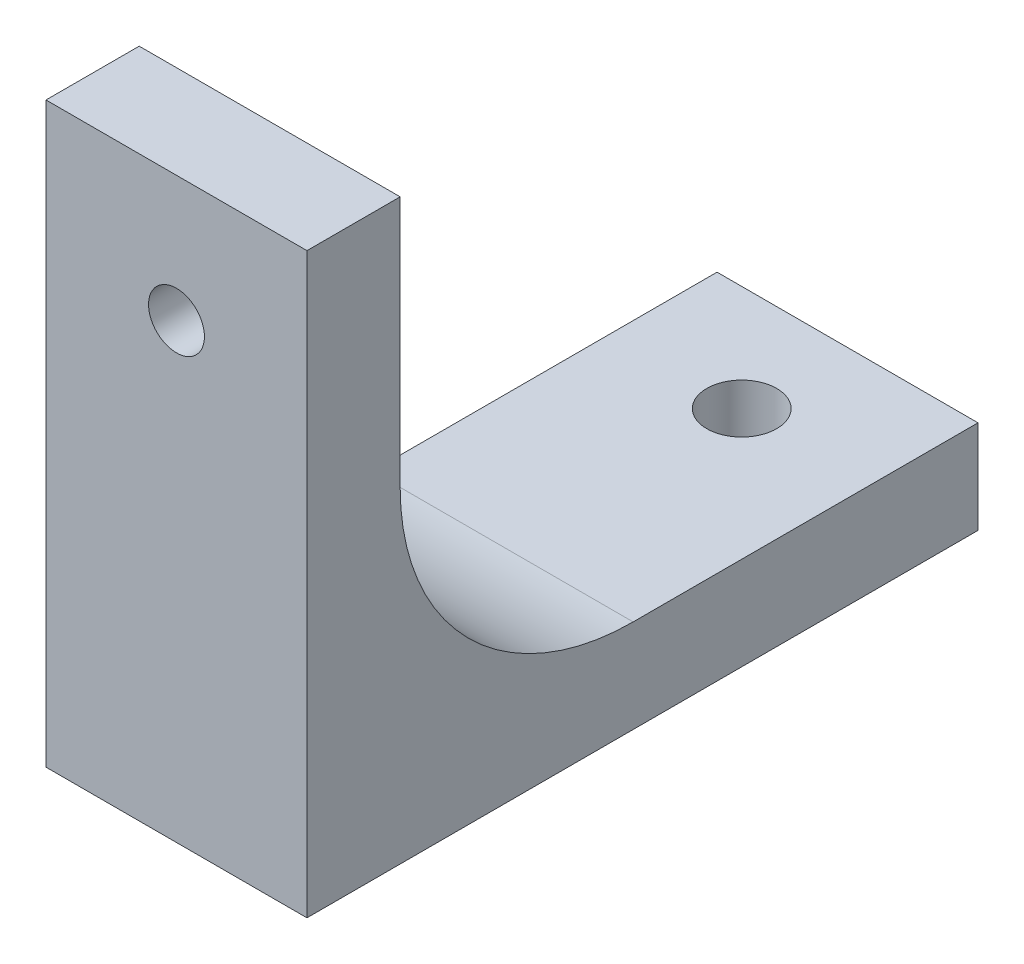
ISO-10303-21;
HEADER;
FILE_DESCRIPTION(('STEP AP214'),'2;1');
FILE_NAME('part.step','',(''),(''),'','','');
FILE_SCHEMA(('AUTOMOTIVE_DESIGN { 1 0 10303 214 1 1 1 1 }'));
ENDSEC;
DATA;
#1=APPLICATION_CONTEXT('core data for automotive mechanical design processes');
#2=APPLICATION_PROTOCOL_DEFINITION('international standard','automotive_design',2000,#1);
#3=PRODUCT_CONTEXT('',#1,'mechanical');
#4=PRODUCT('Part','Part','',(#3));
#5=PRODUCT_RELATED_PRODUCT_CATEGORY('part','',(#4));
#6=PRODUCT_DEFINITION_FORMATION('','',#4);
#7=PRODUCT_DEFINITION_CONTEXT('part definition',#1,'design');
#8=PRODUCT_DEFINITION('design','',#6,#7);
#9=PRODUCT_DEFINITION_SHAPE('','',#8);
#10=(LENGTH_UNIT() NAMED_UNIT(*) SI_UNIT(.MILLI.,.METRE.));
#11=(NAMED_UNIT(*) PLANE_ANGLE_UNIT() SI_UNIT($,.RADIAN.));
#12=(NAMED_UNIT(*) SI_UNIT($,.STERADIAN.) SOLID_ANGLE_UNIT());
#13=UNCERTAINTY_MEASURE_WITH_UNIT(LENGTH_MEASURE(1.E-05),#10,'distance_accuracy_value','');
#14=(GEOMETRIC_REPRESENTATION_CONTEXT(3) GLOBAL_UNCERTAINTY_ASSIGNED_CONTEXT((#13)) GLOBAL_UNIT_ASSIGNED_CONTEXT((#10,
#11,#12)) REPRESENTATION_CONTEXT('',''));
#15=CARTESIAN_POINT('',(0.,0.,0.));
#16=DIRECTION('',(0.,0.,1.));
#17=DIRECTION('',(1.,0.,0.));
#18=AXIS2_PLACEMENT_3D('',#15,#16,#17);
#19=CARTESIAN_POINT('',(14.224,26.416,17.2309955156951));
#20=DIRECTION('',(0.,-1.,0.));
#21=DIRECTION('',(0.,0.,-1.));
#22=AXIS2_PLACEMENT_3D('',#19,#20,#21);
#23=PLANE('',#22);
#24=DIRECTION('',(0.,0.,1.));
#25=VECTOR('',#24,1.);
#26=CARTESIAN_POINT('',(0.,26.416,17.2309955156951));
#27=LINE('',#26,#25);
#28=CARTESIAN_POINT('',(0.,26.416,17.2309955156951));
#29=VERTEX_POINT('',#28);
#30=CARTESIAN_POINT('',(0.,26.416,22.3109955156951));
#31=VERTEX_POINT('',#30);
#32=EDGE_CURVE('E128',#29,#31,#27,.T.);
#33=ORIENTED_EDGE('',*,*,#32,.T.);
#34=DIRECTION('',(-1.,0.,0.));
#35=VECTOR('',#34,1.);
#36=CARTESIAN_POINT('',(14.224,26.416,22.3109955156951));
#37=LINE('',#36,#35);
#38=CARTESIAN_POINT('',(14.224,26.416,22.3109955156951));
#39=VERTEX_POINT('',#38);
#40=EDGE_CURVE('E11',#39,#31,#37,.T.);
#41=ORIENTED_EDGE('',*,*,#40,.F.);
#42=DIRECTION('',(0.,0.,1.));
#43=VECTOR('',#42,1.);
#44=CARTESIAN_POINT('',(14.224,26.416,17.2309955156951));
#45=LINE('',#44,#43);
#46=CARTESIAN_POINT('',(14.224,26.416,17.2309955156951));
#47=VERTEX_POINT('',#46);
#48=EDGE_CURVE('E141',#47,#39,#45,.T.);
#49=ORIENTED_EDGE('',*,*,#48,.F.);
#50=DIRECTION('',(-1.,0.,0.));
#51=VECTOR('',#50,1.);
#52=CARTESIAN_POINT('',(14.224,26.416,17.2309955156951));
#53=LINE('',#52,#51);
#54=EDGE_CURVE('E124',#47,#29,#53,.T.);
#55=ORIENTED_EDGE('',*,*,#54,.T.);
#56=EDGE_LOOP('',(#33,#41,#49,#55));
#57=FACE_BOUND('',#56,.T.);
#58=ADVANCED_FACE('F37',(#57),#23,.F.);
#59=CARTESIAN_POINT('',(14.224,26.416,22.3109955156951));
#60=DIRECTION('',(0.,0.,-1.));
#61=DIRECTION('',(0.,1.,0.));
#62=AXIS2_PLACEMENT_3D('',#59,#60,#61);
#63=PLANE('',#62);
#64=CARTESIAN_POINT('',(7.112,19.558,22.3109955156951));
#65=DIRECTION('',(0.,0.,1.));
#66=DIRECTION('',(1.,0.,0.));
#67=AXIS2_PLACEMENT_3D('',#64,#65,#66);
#68=CIRCLE('',#67,1.524);
#69=CARTESIAN_POINT('',(8.636,19.558,22.3109955156951));
#70=VERTEX_POINT('',#69);
#71=EDGE_CURVE('E166',#70,#70,#68,.T.);
#72=ORIENTED_EDGE('',*,*,#71,.F.);
#73=EDGE_LOOP('',(#72));
#74=FACE_BOUND('',#73,.T.);
#75=DIRECTION('',(0.,-1.,0.));
#76=VECTOR('',#75,1.);
#77=CARTESIAN_POINT('',(0.,26.416,22.3109955156951));
#78=LINE('',#77,#76);
#79=CARTESIAN_POINT('',(0.,-5.08,22.3109955156951));
#80=VERTEX_POINT('',#79);
#81=EDGE_CURVE('E131',#31,#80,#78,.T.);
#82=ORIENTED_EDGE('',*,*,#81,.T.);
#83=DIRECTION('',(-1.,0.,0.));
#84=VECTOR('',#83,1.);
#85=CARTESIAN_POINT('',(14.224,-5.08,22.3109955156951));
#86=LINE('',#85,#84);
#87=CARTESIAN_POINT('',(14.224,-5.08,22.3109955156951));
#88=VERTEX_POINT('',#87);
#89=EDGE_CURVE('E46',#88,#80,#86,.T.);
#90=ORIENTED_EDGE('',*,*,#89,.F.);
#91=DIRECTION('',(0.,-1.,0.));
#92=VECTOR('',#91,1.);
#93=CARTESIAN_POINT('',(14.224,26.416,22.3109955156951));
#94=LINE('',#93,#92);
#95=EDGE_CURVE('E94',#39,#88,#94,.T.);
#96=ORIENTED_EDGE('',*,*,#95,.F.);
#97=ORIENTED_EDGE('',*,*,#40,.T.);
#98=EDGE_LOOP('',(#82,#90,#96,#97));
#99=FACE_BOUND('',#98,.T.);
#100=ADVANCED_FACE('F154',(#74,#99),#63,.F.);
#101=CARTESIAN_POINT('',(14.224,-5.08,17.2309955156951));
#102=DIRECTION('',(0.,1.,0.));
#103=DIRECTION('',(0.,0.,1.));
#104=AXIS2_PLACEMENT_3D('',#101,#102,#103);
#105=PLANE('',#104);
#106=CARTESIAN_POINT('',(7.112,-5.08,-8.49810052014111));
#107=DIRECTION('',(0.,1.,0.));
#108=DIRECTION('',(0.,0.,1.));
#109=AXIS2_PLACEMENT_3D('',#106,#107,#108);
#110=CIRCLE('',#109,1.905);
#111=CARTESIAN_POINT('',(7.112,-5.08,-6.59310052014111));
#112=VERTEX_POINT('',#111);
#113=EDGE_CURVE('E169',#112,#112,#110,.T.);
#114=ORIENTED_EDGE('',*,*,#113,.T.);
#115=EDGE_LOOP('',(#114));
#116=FACE_BOUND('',#115,.T.);
#117=DIRECTION('',(0.,0.,-1.));
#118=VECTOR('',#117,1.);
#119=CARTESIAN_POINT('',(0.,-5.08,17.2309955156951));
#120=LINE('',#119,#118);
#121=CARTESIAN_POINT('',(0.,-5.08,-14.2650044843049));
#122=VERTEX_POINT('',#121);
#123=EDGE_CURVE('E134',#80,#122,#120,.T.);
#124=ORIENTED_EDGE('',*,*,#123,.T.);
#125=DIRECTION('',(-1.,0.,0.));
#126=VECTOR('',#125,1.);
#127=CARTESIAN_POINT('',(14.224,-5.08,-14.2650044843049));
#128=LINE('',#127,#126);
#129=CARTESIAN_POINT('',(14.224,-5.08,-14.2650044843049));
#130=VERTEX_POINT('',#129);
#131=EDGE_CURVE('E145',#130,#122,#128,.T.);
#132=ORIENTED_EDGE('',*,*,#131,.F.);
#133=DIRECTION('',(0.,0.,-1.));
#134=VECTOR('',#133,1.);
#135=CARTESIAN_POINT('',(14.224,-5.08,22.3109955156951));
#136=LINE('',#135,#134);
#137=EDGE_CURVE('E153',#88,#130,#136,.T.);
#138=ORIENTED_EDGE('',*,*,#137,.F.);
#139=ORIENTED_EDGE('',*,*,#89,.T.);
#140=EDGE_LOOP('',(#124,#132,#138,#139));
#141=FACE_BOUND('',#140,.T.);
#142=ADVANCED_FACE('F151',(#116,#141),#105,.F.);
#143=CARTESIAN_POINT('',(14.224,-5.08,-14.2650044843049));
#144=DIRECTION('',(0.,0.,1.));
#145=DIRECTION('',(1.,0.,0.));
#146=AXIS2_PLACEMENT_3D('',#143,#144,#145);
#147=PLANE('',#146);
#148=DIRECTION('',(0.,1.,0.));
#149=VECTOR('',#148,1.);
#150=CARTESIAN_POINT('',(0.,-5.08,-14.2650044843049));
#151=LINE('',#150,#149);
#152=CARTESIAN_POINT('',(0.,0.,-14.2650044843049));
#153=VERTEX_POINT('',#152);
#154=EDGE_CURVE('E136',#122,#153,#151,.T.);
#155=ORIENTED_EDGE('',*,*,#154,.T.);
#156=DIRECTION('',(-1.,0.,0.));
#157=VECTOR('',#156,1.);
#158=CARTESIAN_POINT('',(14.224,0.,-14.2650044843049));
#159=LINE('',#158,#157);
#160=CARTESIAN_POINT('',(14.224,0.,-14.2650044843049));
#161=VERTEX_POINT('',#160);
#162=EDGE_CURVE('E119',#161,#153,#159,.T.);
#163=ORIENTED_EDGE('',*,*,#162,.F.);
#164=DIRECTION('',(0.,1.,0.));
#165=VECTOR('',#164,1.);
#166=CARTESIAN_POINT('',(14.224,-5.08,-14.2650044843049));
#167=LINE('',#166,#165);
#168=EDGE_CURVE('E110',#130,#161,#167,.T.);
#169=ORIENTED_EDGE('',*,*,#168,.F.);
#170=ORIENTED_EDGE('',*,*,#131,.T.);
#171=EDGE_LOOP('',(#155,#163,#169,#170));
#172=FACE_BOUND('',#171,.T.);
#173=ADVANCED_FACE('F161',(#172),#147,.F.);
#174=CARTESIAN_POINT('',(14.224,0.,-14.2650044843049));
#175=DIRECTION('',(0.,-1.,0.));
#176=DIRECTION('',(0.,0.,-1.));
#177=AXIS2_PLACEMENT_3D('',#174,#175,#176);
#178=PLANE('',#177);
#179=CARTESIAN_POINT('',(7.112,0.,-8.49810052014111));
#180=DIRECTION('',(0.,1.,0.));
#181=DIRECTION('',(0.,0.,1.));
#182=AXIS2_PLACEMENT_3D('',#179,#180,#181);
#183=CIRCLE('',#182,1.905);
#184=CARTESIAN_POINT('',(7.112,0.,-6.59310052014111));
#185=VERTEX_POINT('',#184);
#186=EDGE_CURVE('E170',#185,#185,#183,.T.);
#187=ORIENTED_EDGE('',*,*,#186,.F.);
#188=EDGE_LOOP('',(#187));
#189=FACE_BOUND('',#188,.T.);
#190=DIRECTION('',(0.,0.,1.));
#191=VECTOR('',#190,1.);
#192=CARTESIAN_POINT('',(0.,0.,-14.2650044843049));
#193=LINE('',#192,#191);
#194=CARTESIAN_POINT('',(0.,0.,4.53099551569499));
#195=VERTEX_POINT('',#194);
#196=EDGE_CURVE('E118',#153,#195,#193,.T.);
#197=ORIENTED_EDGE('',*,*,#196,.T.);
#198=DIRECTION('',(-1.,0.,0.));
#199=VECTOR('',#198,1.);
#200=CARTESIAN_POINT('',(14.224,0.,4.53099551569499));
#201=LINE('',#200,#199);
#202=CARTESIAN_POINT('',(14.224,0.,4.53099551569499));
#203=VERTEX_POINT('',#202);
#204=EDGE_CURVE('E115',#203,#195,#201,.T.);
#205=ORIENTED_EDGE('',*,*,#204,.F.);
#206=DIRECTION('',(0.,0.,1.));
#207=VECTOR('',#206,1.);
#208=CARTESIAN_POINT('',(14.224,0.,-14.2650044843049));
#209=LINE('',#208,#207);
#210=EDGE_CURVE('E104',#161,#203,#209,.T.);
#211=ORIENTED_EDGE('',*,*,#210,.F.);
#212=ORIENTED_EDGE('',*,*,#162,.T.);
#213=EDGE_LOOP('',(#197,#205,#211,#212));
#214=FACE_BOUND('',#213,.T.);
#215=ADVANCED_FACE('F116',(#189,#214),#178,.F.);
#216=CARTESIAN_POINT('',(14.224,12.7,4.53099551569508));
#217=DIRECTION('',(-1.,0.,0.));
#218=DIRECTION('',(0.,0.,1.));
#219=AXIS2_PLACEMENT_3D('',#216,#217,#218);
#220=CYLINDRICAL_SURFACE('',#219,12.7);
#221=CARTESIAN_POINT('',(0.,12.7,4.53099551569508));
#222=DIRECTION('',(-1.,0.,0.));
#223=DIRECTION('',(0.,0.,1.));
#224=AXIS2_PLACEMENT_3D('',#221,#222,#223);
#225=CIRCLE('',#224,12.7);
#226=CARTESIAN_POINT('',(0.,12.7000000000001,17.2309955156951));
#227=VERTEX_POINT('',#226);
#228=EDGE_CURVE('E80',#195,#227,#225,.T.);
#229=ORIENTED_EDGE('',*,*,#228,.T.);
#230=DIRECTION('',(-1.,0.,0.));
#231=VECTOR('',#230,1.);
#232=CARTESIAN_POINT('',(14.224,12.7000000000001,17.2309955156951));
#233=LINE('',#232,#231);
#234=CARTESIAN_POINT('',(14.224,12.7000000000001,17.2309955156951));
#235=VERTEX_POINT('',#234);
#236=EDGE_CURVE('E120',#235,#227,#233,.T.);
#237=ORIENTED_EDGE('',*,*,#236,.F.);
#238=CARTESIAN_POINT('',(14.224,12.7,4.53099551569508));
#239=DIRECTION('',(-1.,0.,0.));
#240=DIRECTION('',(0.,0.,1.));
#241=AXIS2_PLACEMENT_3D('',#238,#239,#240);
#242=CIRCLE('',#241,12.7);
#243=EDGE_CURVE('E108',#203,#235,#242,.T.);
#244=ORIENTED_EDGE('',*,*,#243,.F.);
#245=ORIENTED_EDGE('',*,*,#204,.T.);
#246=EDGE_LOOP('',(#229,#237,#244,#245));
#247=FACE_BOUND('',#246,.T.);
#248=ADVANCED_FACE('F122',(#247),#220,.F.);
#249=CARTESIAN_POINT('',(14.224,26.416,17.2309955156951));
#250=DIRECTION('',(0.,0.,1.));
#251=DIRECTION('',(0.,-1.,0.));
#252=AXIS2_PLACEMENT_3D('',#249,#250,#251);
#253=PLANE('',#252);
#254=CARTESIAN_POINT('',(7.112,19.558,17.2309955156951));
#255=DIRECTION('',(0.,0.,1.));
#256=DIRECTION('',(0.,-1.,0.));
#257=AXIS2_PLACEMENT_3D('',#254,#255,#256);
#258=CIRCLE('',#257,1.524);
#259=CARTESIAN_POINT('',(7.112,18.034,17.2309955156951));
#260=VERTEX_POINT('',#259);
#261=EDGE_CURVE('E40',#260,#260,#258,.T.);
#262=ORIENTED_EDGE('',*,*,#261,.T.);
#263=EDGE_LOOP('',(#262));
#264=FACE_BOUND('',#263,.T.);
#265=DIRECTION('',(0.,1.,0.));
#266=VECTOR('',#265,1.);
#267=CARTESIAN_POINT('',(0.,26.416,17.2309955156951));
#268=LINE('',#267,#266);
#269=EDGE_CURVE('E86',#227,#29,#268,.T.);
#270=ORIENTED_EDGE('',*,*,#269,.T.);
#271=ORIENTED_EDGE('',*,*,#54,.F.);
#272=DIRECTION('',(0.,1.,0.));
#273=VECTOR('',#272,1.);
#274=CARTESIAN_POINT('',(14.224,26.416,17.2309955156951));
#275=LINE('',#274,#273);
#276=EDGE_CURVE('E54',#235,#47,#275,.T.);
#277=ORIENTED_EDGE('',*,*,#276,.F.);
#278=ORIENTED_EDGE('',*,*,#236,.T.);
#279=EDGE_LOOP('',(#270,#271,#277,#278));
#280=FACE_BOUND('',#279,.T.);
#281=ADVANCED_FACE('F190',(#264,#280),#253,.F.);
#282=CARTESIAN_POINT('',(14.224,12.7,4.53099551569508));
#283=DIRECTION('',(-1.,0.,0.));
#284=DIRECTION('',(0.,0.,1.));
#285=AXIS2_PLACEMENT_3D('',#282,#283,#284);
#286=PLANE('',#285);
#287=ORIENTED_EDGE('',*,*,#48,.T.);
#288=ORIENTED_EDGE('',*,*,#95,.T.);
#289=ORIENTED_EDGE('',*,*,#137,.T.);
#290=ORIENTED_EDGE('',*,*,#168,.T.);
#291=ORIENTED_EDGE('',*,*,#210,.T.);
#292=ORIENTED_EDGE('',*,*,#243,.T.);
#293=ORIENTED_EDGE('',*,*,#276,.T.);
#294=EDGE_LOOP('',(#287,#288,#289,#290,#291,#292,#293));
#295=FACE_BOUND('',#294,.T.);
#296=ADVANCED_FACE('F106',(#295),#286,.F.);
#297=CARTESIAN_POINT('',(0.,12.7,4.53099551569508));
#298=DIRECTION('',(-1.,0.,0.));
#299=DIRECTION('',(0.,0.,1.));
#300=AXIS2_PLACEMENT_3D('',#297,#298,#299);
#301=PLANE('',#300);
#302=ORIENTED_EDGE('',*,*,#32,.F.);
#303=ORIENTED_EDGE('',*,*,#269,.F.);
#304=ORIENTED_EDGE('',*,*,#228,.F.);
#305=ORIENTED_EDGE('',*,*,#196,.F.);
#306=ORIENTED_EDGE('',*,*,#154,.F.);
#307=ORIENTED_EDGE('',*,*,#123,.F.);
#308=ORIENTED_EDGE('',*,*,#81,.F.);
#309=EDGE_LOOP('',(#302,#303,#304,#305,#306,#307,#308));
#310=FACE_BOUND('',#309,.T.);
#311=ADVANCED_FACE('F158',(#310),#301,.T.);
#312=CARTESIAN_POINT('',(7.112,19.558,-14.2650044843049));
#313=DIRECTION('',(0.,0.,1.));
#314=DIRECTION('',(1.,0.,0.));
#315=AXIS2_PLACEMENT_3D('',#312,#313,#314);
#316=CYLINDRICAL_SURFACE('',#315,1.524);
#317=ORIENTED_EDGE('',*,*,#71,.T.);
#318=EDGE_LOOP('',(#317));
#319=FACE_BOUND('',#318,.T.);
#320=ORIENTED_EDGE('',*,*,#261,.F.);
#321=EDGE_LOOP('',(#320));
#322=FACE_BOUND('',#321,.T.);
#323=ADVANCED_FACE('F180',(#319,#322),#316,.F.);
#324=CARTESIAN_POINT('',(7.112,-5.08,-8.49810052014111));
#325=DIRECTION('',(0.,1.,0.));
#326=DIRECTION('',(0.,0.,1.));
#327=AXIS2_PLACEMENT_3D('',#324,#325,#326);
#328=CYLINDRICAL_SURFACE('',#327,1.905);
#329=ORIENTED_EDGE('',*,*,#113,.F.);
#330=EDGE_LOOP('',(#329));
#331=FACE_BOUND('',#330,.T.);
#332=ORIENTED_EDGE('',*,*,#186,.T.);
#333=EDGE_LOOP('',(#332));
#334=FACE_BOUND('',#333,.T.);
#335=ADVANCED_FACE('F177',(#331,#334),#328,.F.);
#336=CLOSED_SHELL('',(#58,#100,#142,#173,#215,#248,#281,#296,#311,#323,#335));
#337=MANIFOLD_SOLID_BREP('B2',#336);
#338=ADVANCED_BREP_SHAPE_REPRESENTATION('',(#18,#337),#14);
#339=SHAPE_DEFINITION_REPRESENTATION(#9,#338);
ENDSEC;
END-ISO-10303-21;
